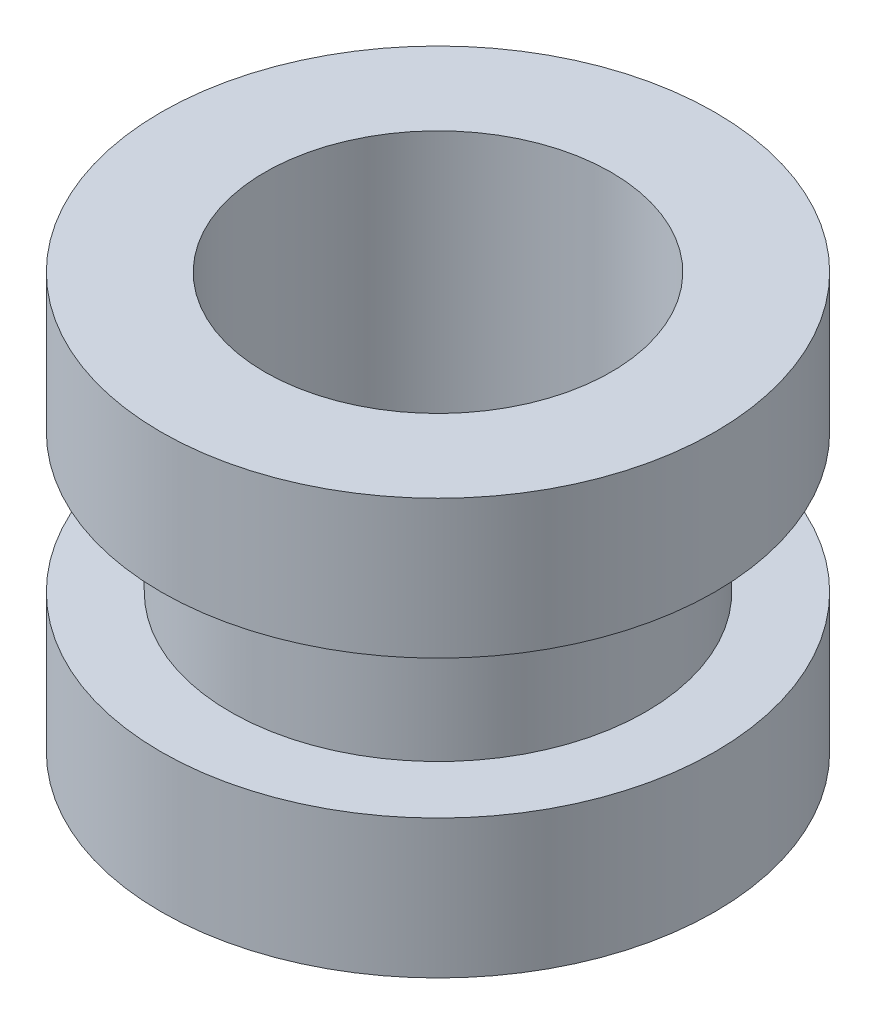
ISO-10303-21;
HEADER;
FILE_DESCRIPTION(('STEP AP214'),'2;1');
FILE_NAME('part.step','',(''),(''),'','','');
FILE_SCHEMA(('AUTOMOTIVE_DESIGN { 1 0 10303 214 1 1 1 1 }'));
ENDSEC;
DATA;
#1=APPLICATION_CONTEXT('core data for automotive mechanical design processes');
#2=APPLICATION_PROTOCOL_DEFINITION('international standard','automotive_design',2000,#1);
#3=PRODUCT_CONTEXT('',#1,'mechanical');
#4=PRODUCT('Part','Part','',(#3));
#5=PRODUCT_RELATED_PRODUCT_CATEGORY('part','',(#4));
#6=PRODUCT_DEFINITION_FORMATION('','',#4);
#7=PRODUCT_DEFINITION_CONTEXT('part definition',#1,'design');
#8=PRODUCT_DEFINITION('design','',#6,#7);
#9=PRODUCT_DEFINITION_SHAPE('','',#8);
#10=(LENGTH_UNIT() NAMED_UNIT(*) SI_UNIT(.MILLI.,.METRE.));
#11=(NAMED_UNIT(*) PLANE_ANGLE_UNIT() SI_UNIT($,.RADIAN.));
#12=(NAMED_UNIT(*) SI_UNIT($,.STERADIAN.) SOLID_ANGLE_UNIT());
#13=UNCERTAINTY_MEASURE_WITH_UNIT(LENGTH_MEASURE(1.E-05),#10,'distance_accuracy_value','');
#14=(GEOMETRIC_REPRESENTATION_CONTEXT(3) GLOBAL_UNCERTAINTY_ASSIGNED_CONTEXT((#13)) GLOBAL_UNIT_ASSIGNED_CONTEXT((#10,
#11,#12)) REPRESENTATION_CONTEXT('',''));
#15=CARTESIAN_POINT('',(0.,0.,0.));
#16=DIRECTION('',(0.,0.,1.));
#17=DIRECTION('',(1.,0.,0.));
#18=AXIS2_PLACEMENT_3D('',#15,#16,#17);
#19=CARTESIAN_POINT('',(0.,7.62,0.));
#20=DIRECTION('',(0.,1.,0.));
#21=DIRECTION('',(-1.,0.,0.));
#22=AXIS2_PLACEMENT_3D('',#19,#20,#21);
#23=PLANE('',#22);
#24=CARTESIAN_POINT('',(0.,7.62,0.));
#25=DIRECTION('',(0.,1.,0.));
#26=DIRECTION('',(0.,0.,1.));
#27=AXIS2_PLACEMENT_3D('',#24,#25,#26);
#28=CIRCLE('',#27,3.175);
#29=CARTESIAN_POINT('',(0.,7.62,3.175));
#30=VERTEX_POINT('',#29);
#31=EDGE_CURVE('E69',#30,#30,#28,.T.);
#32=ORIENTED_EDGE('',*,*,#31,.F.);
#33=EDGE_LOOP('',(#32));
#34=FACE_BOUND('',#33,.T.);
#35=CARTESIAN_POINT('',(0.,7.62,0.));
#36=DIRECTION('',(0.,-1.,0.));
#37=DIRECTION('',(1.,0.,0.));
#38=AXIS2_PLACEMENT_3D('',#35,#36,#37);
#39=CIRCLE('',#38,5.08);
#40=CARTESIAN_POINT('',(5.08,7.62,0.));
#41=VERTEX_POINT('',#40);
#42=EDGE_CURVE('E10',#41,#41,#39,.T.);
#43=ORIENTED_EDGE('',*,*,#42,.F.);
#44=EDGE_LOOP('',(#43));
#45=FACE_BOUND('',#44,.T.);
#46=ADVANCED_FACE('F37',(#34,#45),#23,.T.);
#47=CARTESIAN_POINT('',(0.,0.,0.));
#48=DIRECTION('',(0.,-1.,0.));
#49=DIRECTION('',(1.,0.,0.));
#50=AXIS2_PLACEMENT_3D('',#47,#48,#49);
#51=CYLINDRICAL_SURFACE('',#50,5.08);
#52=ORIENTED_EDGE('',*,*,#42,.T.);
#53=EDGE_LOOP('',(#52));
#54=FACE_BOUND('',#53,.T.);
#55=CARTESIAN_POINT('',(0.,5.08,0.));
#56=DIRECTION('',(0.,-1.,0.));
#57=DIRECTION('',(1.,0.,0.));
#58=AXIS2_PLACEMENT_3D('',#55,#56,#57);
#59=CIRCLE('',#58,5.08);
#60=CARTESIAN_POINT('',(5.08,5.08,0.));
#61=VERTEX_POINT('',#60);
#62=EDGE_CURVE('E44',#61,#61,#59,.T.);
#63=ORIENTED_EDGE('',*,*,#62,.F.);
#64=EDGE_LOOP('',(#63));
#65=FACE_BOUND('',#64,.T.);
#66=ADVANCED_FACE('F88',(#54,#65),#51,.T.);
#67=CARTESIAN_POINT('',(5.08,5.08,0.));
#68=DIRECTION('',(0.,-1.,0.));
#69=DIRECTION('',(1.,0.,0.));
#70=AXIS2_PLACEMENT_3D('',#67,#68,#69);
#71=PLANE('',#70);
#72=ORIENTED_EDGE('',*,*,#62,.T.);
#73=EDGE_LOOP('',(#72));
#74=FACE_BOUND('',#73,.T.);
#75=CARTESIAN_POINT('',(0.,5.08,0.));
#76=DIRECTION('',(0.,-1.,0.));
#77=DIRECTION('',(1.,0.,0.));
#78=AXIS2_PLACEMENT_3D('',#75,#76,#77);
#79=CIRCLE('',#78,3.81);
#80=CARTESIAN_POINT('',(3.81,5.08,0.));
#81=VERTEX_POINT('',#80);
#82=EDGE_CURVE('E49',#81,#81,#79,.T.);
#83=ORIENTED_EDGE('',*,*,#82,.F.);
#84=EDGE_LOOP('',(#83));
#85=FACE_BOUND('',#84,.T.);
#86=ADVANCED_FACE('F92',(#74,#85),#71,.T.);
#87=CARTESIAN_POINT('',(0.,0.,0.));
#88=DIRECTION('',(0.,-1.,0.));
#89=DIRECTION('',(1.,0.,0.));
#90=AXIS2_PLACEMENT_3D('',#87,#88,#89);
#91=CYLINDRICAL_SURFACE('',#90,3.81);
#92=ORIENTED_EDGE('',*,*,#82,.T.);
#93=EDGE_LOOP('',(#92));
#94=FACE_BOUND('',#93,.T.);
#95=CARTESIAN_POINT('',(0.,2.54,0.));
#96=DIRECTION('',(0.,-1.,0.));
#97=DIRECTION('',(1.,0.,0.));
#98=AXIS2_PLACEMENT_3D('',#95,#96,#97);
#99=CIRCLE('',#98,3.81);
#100=CARTESIAN_POINT('',(3.81,2.54,0.));
#101=VERTEX_POINT('',#100);
#102=EDGE_CURVE('E54',#101,#101,#99,.T.);
#103=ORIENTED_EDGE('',*,*,#102,.F.);
#104=EDGE_LOOP('',(#103));
#105=FACE_BOUND('',#104,.T.);
#106=ADVANCED_FACE('F96',(#94,#105),#91,.T.);
#107=CARTESIAN_POINT('',(5.08,2.54,0.));
#108=DIRECTION('',(0.,1.,0.));
#109=DIRECTION('',(-1.,0.,0.));
#110=AXIS2_PLACEMENT_3D('',#107,#108,#109);
#111=PLANE('',#110);
#112=ORIENTED_EDGE('',*,*,#102,.T.);
#113=EDGE_LOOP('',(#112));
#114=FACE_BOUND('',#113,.T.);
#115=CARTESIAN_POINT('',(0.,2.54,0.));
#116=DIRECTION('',(0.,-1.,0.));
#117=DIRECTION('',(1.,0.,0.));
#118=AXIS2_PLACEMENT_3D('',#115,#116,#117);
#119=CIRCLE('',#118,5.08);
#120=CARTESIAN_POINT('',(5.08,2.54,0.));
#121=VERTEX_POINT('',#120);
#122=EDGE_CURVE('E60',#121,#121,#119,.T.);
#123=ORIENTED_EDGE('',*,*,#122,.F.);
#124=EDGE_LOOP('',(#123));
#125=FACE_BOUND('',#124,.T.);
#126=ADVANCED_FACE('F102',(#114,#125),#111,.T.);
#127=CARTESIAN_POINT('',(0.,0.,0.));
#128=DIRECTION('',(0.,-1.,0.));
#129=DIRECTION('',(1.,0.,0.));
#130=AXIS2_PLACEMENT_3D('',#127,#128,#129);
#131=CYLINDRICAL_SURFACE('',#130,5.08);
#132=ORIENTED_EDGE('',*,*,#122,.T.);
#133=EDGE_LOOP('',(#132));
#134=FACE_BOUND('',#133,.T.);
#135=CARTESIAN_POINT('',(0.,0.,0.));
#136=DIRECTION('',(0.,-1.,0.));
#137=DIRECTION('',(1.,0.,0.));
#138=AXIS2_PLACEMENT_3D('',#135,#136,#137);
#139=CIRCLE('',#138,5.08);
#140=CARTESIAN_POINT('',(5.08,0.,0.));
#141=VERTEX_POINT('',#140);
#142=EDGE_CURVE('E64',#141,#141,#139,.T.);
#143=ORIENTED_EDGE('',*,*,#142,.F.);
#144=EDGE_LOOP('',(#143));
#145=FACE_BOUND('',#144,.T.);
#146=ADVANCED_FACE('F106',(#134,#145),#131,.T.);
#147=CARTESIAN_POINT('',(0.,0.,0.));
#148=DIRECTION('',(0.,-1.,0.));
#149=DIRECTION('',(1.,0.,0.));
#150=AXIS2_PLACEMENT_3D('',#147,#148,#149);
#151=PLANE('',#150);
#152=CARTESIAN_POINT('',(0.,0.,0.));
#153=DIRECTION('',(0.,1.,0.));
#154=DIRECTION('',(0.,0.,1.));
#155=AXIS2_PLACEMENT_3D('',#152,#153,#154);
#156=CIRCLE('',#155,3.175);
#157=CARTESIAN_POINT('',(0.,0.,3.175));
#158=VERTEX_POINT('',#157);
#159=EDGE_CURVE('E68',#158,#158,#156,.T.);
#160=ORIENTED_EDGE('',*,*,#159,.T.);
#161=EDGE_LOOP('',(#160));
#162=FACE_BOUND('',#161,.T.);
#163=ORIENTED_EDGE('',*,*,#142,.T.);
#164=EDGE_LOOP('',(#163));
#165=FACE_BOUND('',#164,.T.);
#166=ADVANCED_FACE('F77',(#162,#165),#151,.T.);
#167=CARTESIAN_POINT('',(0.,0.,0.));
#168=DIRECTION('',(0.,1.,0.));
#169=DIRECTION('',(0.,0.,1.));
#170=AXIS2_PLACEMENT_3D('',#167,#168,#169);
#171=CYLINDRICAL_SURFACE('',#170,3.175);
#172=ORIENTED_EDGE('',*,*,#159,.F.);
#173=EDGE_LOOP('',(#172));
#174=FACE_BOUND('',#173,.T.);
#175=ORIENTED_EDGE('',*,*,#31,.T.);
#176=EDGE_LOOP('',(#175));
#177=FACE_BOUND('',#176,.T.);
#178=ADVANCED_FACE('F80',(#174,#177),#171,.F.);
#179=CLOSED_SHELL('',(#46,#66,#86,#106,#126,#146,#166,#178));
#180=MANIFOLD_SOLID_BREP('B2',#179);
#181=ADVANCED_BREP_SHAPE_REPRESENTATION('',(#18,#180),#14);
#182=SHAPE_DEFINITION_REPRESENTATION(#9,#181);
ENDSEC;
END-ISO-10303-21;
